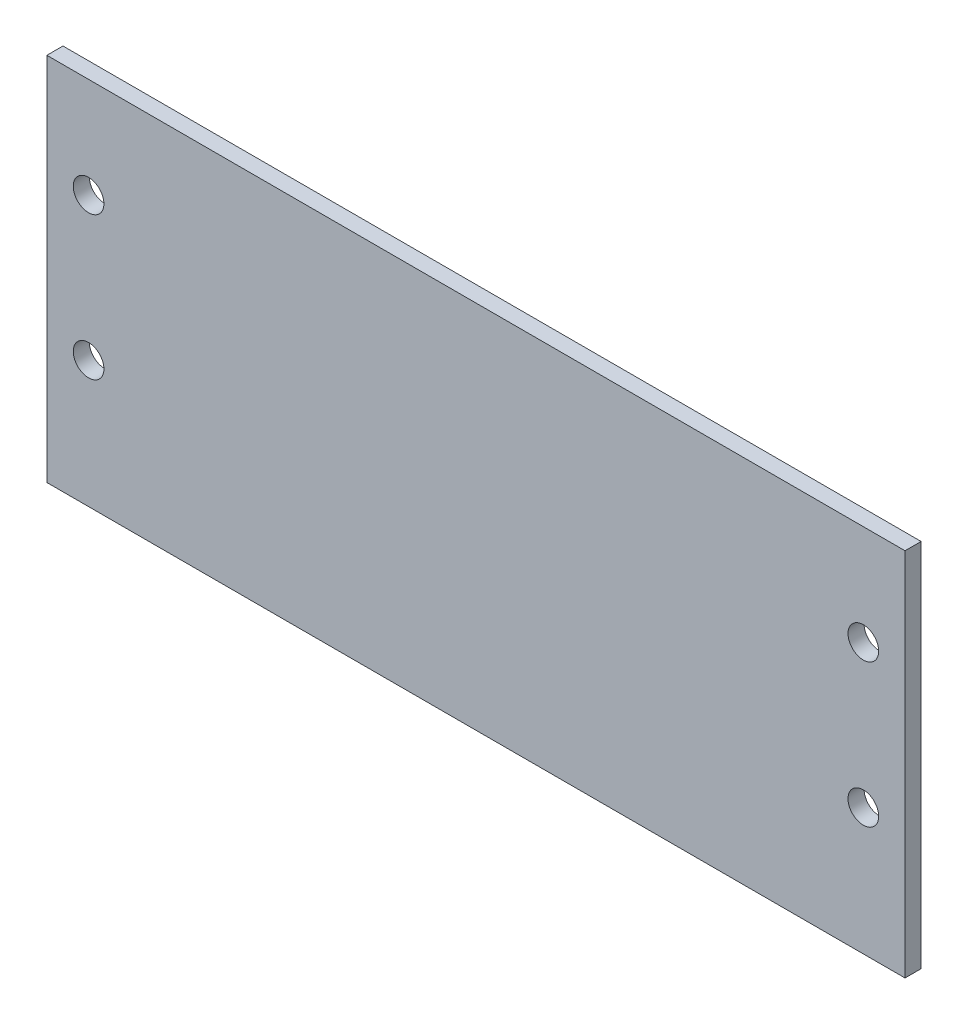
ISO-10303-21;
HEADER;
FILE_DESCRIPTION(('STEP AP214'),'2;1');
FILE_NAME('part.step','',(''),(''),'','','');
FILE_SCHEMA(('AUTOMOTIVE_DESIGN { 1 0 10303 214 1 1 1 1 }'));
ENDSEC;
DATA;
#1=APPLICATION_CONTEXT('core data for automotive mechanical design processes');
#2=APPLICATION_PROTOCOL_DEFINITION('international standard','automotive_design',2000,#1);
#3=PRODUCT_CONTEXT('',#1,'mechanical');
#4=PRODUCT('Part','Part','',(#3));
#5=PRODUCT_RELATED_PRODUCT_CATEGORY('part','',(#4));
#6=PRODUCT_DEFINITION_FORMATION('','',#4);
#7=PRODUCT_DEFINITION_CONTEXT('part definition',#1,'design');
#8=PRODUCT_DEFINITION('design','',#6,#7);
#9=PRODUCT_DEFINITION_SHAPE('','',#8);
#10=(LENGTH_UNIT() NAMED_UNIT(*) SI_UNIT(.MILLI.,.METRE.));
#11=(NAMED_UNIT(*) PLANE_ANGLE_UNIT() SI_UNIT($,.RADIAN.));
#12=(NAMED_UNIT(*) SI_UNIT($,.STERADIAN.) SOLID_ANGLE_UNIT());
#13=UNCERTAINTY_MEASURE_WITH_UNIT(LENGTH_MEASURE(1.E-05),#10,'distance_accuracy_value','');
#14=(GEOMETRIC_REPRESENTATION_CONTEXT(3) GLOBAL_UNCERTAINTY_ASSIGNED_CONTEXT((#13)) GLOBAL_UNIT_ASSIGNED_CONTEXT((#10,
#11,#12)) REPRESENTATION_CONTEXT('',''));
#15=CARTESIAN_POINT('',(0.,0.,0.));
#16=DIRECTION('',(0.,0.,1.));
#17=DIRECTION('',(1.,0.,0.));
#18=AXIS2_PLACEMENT_3D('',#15,#16,#17);
#19=CARTESIAN_POINT('',(-274.987878787879,130.65034965035,10.));
#20=DIRECTION('',(1.,0.,0.));
#21=DIRECTION('',(0.,0.,-1.));
#22=AXIS2_PLACEMENT_3D('',#19,#20,#21);
#23=PLANE('',#22);
#24=DIRECTION('',(0.,-1.,0.));
#25=VECTOR('',#24,1.);
#26=CARTESIAN_POINT('',(-274.987878787879,130.65034965035,0.));
#27=LINE('',#26,#25);
#28=CARTESIAN_POINT('',(-274.987878787879,130.65034965035,0.));
#29=VERTEX_POINT('',#28);
#30=CARTESIAN_POINT('',(-274.987878787879,-99.3496503496504,0.));
#31=VERTEX_POINT('',#30);
#32=EDGE_CURVE('E106',#29,#31,#27,.T.);
#33=ORIENTED_EDGE('',*,*,#32,.T.);
#34=DIRECTION('',(0.,0.,-1.));
#35=VECTOR('',#34,1.);
#36=CARTESIAN_POINT('',(-274.987878787879,-99.3496503496504,10.));
#37=LINE('',#36,#35);
#38=CARTESIAN_POINT('',(-274.987878787879,-99.3496503496504,10.));
#39=VERTEX_POINT('',#38);
#40=EDGE_CURVE('E11',#39,#31,#37,.T.);
#41=ORIENTED_EDGE('',*,*,#40,.F.);
#42=DIRECTION('',(0.,-1.,0.));
#43=VECTOR('',#42,1.);
#44=CARTESIAN_POINT('',(-274.987878787879,130.65034965035,10.));
#45=LINE('',#44,#43);
#46=CARTESIAN_POINT('',(-274.987878787879,130.65034965035,10.));
#47=VERTEX_POINT('',#46);
#48=EDGE_CURVE('E90',#47,#39,#45,.T.);
#49=ORIENTED_EDGE('',*,*,#48,.F.);
#50=DIRECTION('',(0.,0.,-1.));
#51=VECTOR('',#50,1.);
#52=CARTESIAN_POINT('',(-274.987878787879,130.65034965035,10.));
#53=LINE('',#52,#51);
#54=EDGE_CURVE('E102',#47,#29,#53,.T.);
#55=ORIENTED_EDGE('',*,*,#54,.T.);
#56=EDGE_LOOP('',(#33,#41,#49,#55));
#57=FACE_BOUND('',#56,.T.);
#58=ADVANCED_FACE('F38',(#57),#23,.F.);
#59=CARTESIAN_POINT('',(-274.987878787879,-99.3496503496504,10.));
#60=DIRECTION('',(0.,1.,0.));
#61=DIRECTION('',(0.,0.,1.));
#62=AXIS2_PLACEMENT_3D('',#59,#60,#61);
#63=PLANE('',#62);
#64=DIRECTION('',(1.,0.,0.));
#65=VECTOR('',#64,1.);
#66=CARTESIAN_POINT('',(-274.987878787879,-99.3496503496504,0.));
#67=LINE('',#66,#65);
#68=CARTESIAN_POINT('',(258.412121212121,-99.3496503496504,0.));
#69=VERTEX_POINT('',#68);
#70=EDGE_CURVE('E95',#31,#69,#67,.T.);
#71=ORIENTED_EDGE('',*,*,#70,.T.);
#72=DIRECTION('',(0.,0.,-1.));
#73=VECTOR('',#72,1.);
#74=CARTESIAN_POINT('',(258.412121212121,-99.3496503496504,10.));
#75=LINE('',#74,#73);
#76=CARTESIAN_POINT('',(258.412121212121,-99.3496503496504,10.));
#77=VERTEX_POINT('',#76);
#78=EDGE_CURVE('E47',#77,#69,#75,.T.);
#79=ORIENTED_EDGE('',*,*,#78,.F.);
#80=DIRECTION('',(1.,0.,0.));
#81=VECTOR('',#80,1.);
#82=CARTESIAN_POINT('',(-274.987878787879,-99.3496503496504,10.));
#83=LINE('',#82,#81);
#84=EDGE_CURVE('E85',#39,#77,#83,.T.);
#85=ORIENTED_EDGE('',*,*,#84,.F.);
#86=ORIENTED_EDGE('',*,*,#40,.T.);
#87=EDGE_LOOP('',(#71,#79,#85,#86));
#88=FACE_BOUND('',#87,.T.);
#89=ADVANCED_FACE('F94',(#88),#63,.F.);
#90=CARTESIAN_POINT('',(258.412121212121,130.65034965035,10.));
#91=DIRECTION('',(-1.,0.,0.));
#92=DIRECTION('',(0.,-1.,0.));
#93=AXIS2_PLACEMENT_3D('',#90,#91,#92);
#94=PLANE('',#93);
#95=DIRECTION('',(0.,1.,0.));
#96=VECTOR('',#95,1.);
#97=CARTESIAN_POINT('',(258.412121212121,130.65034965035,0.));
#98=LINE('',#97,#96);
#99=CARTESIAN_POINT('',(258.412121212121,130.65034965035,0.));
#100=VERTEX_POINT('',#99);
#101=EDGE_CURVE('E72',#69,#100,#98,.T.);
#102=ORIENTED_EDGE('',*,*,#101,.T.);
#103=DIRECTION('',(0.,0.,-1.));
#104=VECTOR('',#103,1.);
#105=CARTESIAN_POINT('',(258.412121212121,130.65034965035,10.));
#106=LINE('',#105,#104);
#107=CARTESIAN_POINT('',(258.412121212121,130.65034965035,10.));
#108=VERTEX_POINT('',#107);
#109=EDGE_CURVE('E97',#108,#100,#106,.T.);
#110=ORIENTED_EDGE('',*,*,#109,.F.);
#111=DIRECTION('',(0.,1.,0.));
#112=VECTOR('',#111,1.);
#113=CARTESIAN_POINT('',(258.412121212121,130.65034965035,10.));
#114=LINE('',#113,#112);
#115=EDGE_CURVE('E88',#77,#108,#114,.T.);
#116=ORIENTED_EDGE('',*,*,#115,.F.);
#117=ORIENTED_EDGE('',*,*,#78,.T.);
#118=EDGE_LOOP('',(#102,#110,#116,#117));
#119=FACE_BOUND('',#118,.T.);
#120=ADVANCED_FACE('F98',(#119),#94,.F.);
#121=CARTESIAN_POINT('',(-274.987878787879,130.65034965035,10.));
#122=DIRECTION('',(0.,-1.,0.));
#123=DIRECTION('',(0.,0.,-1.));
#124=AXIS2_PLACEMENT_3D('',#121,#122,#123);
#125=PLANE('',#124);
#126=DIRECTION('',(-1.,0.,0.));
#127=VECTOR('',#126,1.);
#128=CARTESIAN_POINT('',(-274.987878787879,130.65034965035,0.));
#129=LINE('',#128,#127);
#130=EDGE_CURVE('E78',#100,#29,#129,.T.);
#131=ORIENTED_EDGE('',*,*,#130,.T.);
#132=ORIENTED_EDGE('',*,*,#54,.F.);
#133=DIRECTION('',(-1.,0.,0.));
#134=VECTOR('',#133,1.);
#135=CARTESIAN_POINT('',(-274.987878787879,130.65034965035,10.));
#136=LINE('',#135,#134);
#137=EDGE_CURVE('E55',#108,#47,#136,.T.);
#138=ORIENTED_EDGE('',*,*,#137,.F.);
#139=ORIENTED_EDGE('',*,*,#109,.T.);
#140=EDGE_LOOP('',(#131,#132,#138,#139));
#141=FACE_BOUND('',#140,.T.);
#142=ADVANCED_FACE('F120',(#141),#125,.F.);
#143=CARTESIAN_POINT('',(0.,0.,10.));
#144=DIRECTION('',(0.,0.,1.));
#145=DIRECTION('',(1.,0.,0.));
#146=AXIS2_PLACEMENT_3D('',#143,#144,#145);
#147=PLANE('',#146);
#148=CARTESIAN_POINT('',(232.50412121212,-20.5276503496493,10.));
#149=DIRECTION('',(0.,0.,1.));
#150=DIRECTION('',(1.,0.,0.));
#151=AXIS2_PLACEMENT_3D('',#148,#149,#150);
#152=CIRCLE('',#151,9.52500000000002);
#153=CARTESIAN_POINT('',(242.02912121212,-20.5276503496493,10.));
#154=VERTEX_POINT('',#153);
#155=EDGE_CURVE('E144',#154,#154,#152,.T.);
#156=ORIENTED_EDGE('',*,*,#155,.F.);
#157=EDGE_LOOP('',(#156));
#158=FACE_BOUND('',#157,.T.);
#159=CARTESIAN_POINT('',(-249.07987878788,68.3723496503497,10.));
#160=DIRECTION('',(0.,0.,1.));
#161=DIRECTION('',(1.,0.,0.));
#162=AXIS2_PLACEMENT_3D('',#159,#160,#161);
#163=CIRCLE('',#162,9.52499999999991);
#164=CARTESIAN_POINT('',(-239.55487878788,68.3723496503497,10.));
#165=VERTEX_POINT('',#164);
#166=EDGE_CURVE('E135',#165,#165,#163,.T.);
#167=ORIENTED_EDGE('',*,*,#166,.F.);
#168=EDGE_LOOP('',(#167));
#169=FACE_BOUND('',#168,.T.);
#170=CARTESIAN_POINT('',(-249.07987878788,-20.5276503496492,10.));
#171=DIRECTION('',(0.,0.,1.));
#172=DIRECTION('',(1.,0.,0.));
#173=AXIS2_PLACEMENT_3D('',#170,#171,#172);
#174=CIRCLE('',#173,9.52499999999996);
#175=CARTESIAN_POINT('',(-239.55487878788,-20.5276503496492,10.));
#176=VERTEX_POINT('',#175);
#177=EDGE_CURVE('E151',#176,#176,#174,.T.);
#178=ORIENTED_EDGE('',*,*,#177,.F.);
#179=EDGE_LOOP('',(#178));
#180=FACE_BOUND('',#179,.T.);
#181=CARTESIAN_POINT('',(232.50412121212,68.3723496503496,10.));
#182=DIRECTION('',(0.,0.,1.));
#183=DIRECTION('',(1.,0.,0.));
#184=AXIS2_PLACEMENT_3D('',#181,#182,#183);
#185=CIRCLE('',#184,9.52499999999996);
#186=CARTESIAN_POINT('',(242.02912121212,68.3723496503496,10.));
#187=VERTEX_POINT('',#186);
#188=EDGE_CURVE('E127',#187,#187,#185,.T.);
#189=ORIENTED_EDGE('',*,*,#188,.F.);
#190=EDGE_LOOP('',(#189));
#191=FACE_BOUND('',#190,.T.);
#192=ORIENTED_EDGE('',*,*,#48,.T.);
#193=ORIENTED_EDGE('',*,*,#84,.T.);
#194=ORIENTED_EDGE('',*,*,#115,.T.);
#195=ORIENTED_EDGE('',*,*,#137,.T.);
#196=EDGE_LOOP('',(#192,#193,#194,#195));
#197=FACE_BOUND('',#196,.T.);
#198=ADVANCED_FACE('F86',(#158,#169,#180,#191,#197),#147,.T.);
#199=CARTESIAN_POINT('',(0.,0.,0.));
#200=DIRECTION('',(0.,0.,1.));
#201=DIRECTION('',(1.,0.,0.));
#202=AXIS2_PLACEMENT_3D('',#199,#200,#201);
#203=PLANE('',#202);
#204=CARTESIAN_POINT('',(232.50412121212,-20.5276503496493,0.));
#205=DIRECTION('',(0.,0.,1.));
#206=DIRECTION('',(1.,0.,0.));
#207=AXIS2_PLACEMENT_3D('',#204,#205,#206);
#208=CIRCLE('',#207,9.52500000000002);
#209=CARTESIAN_POINT('',(242.02912121212,-20.5276503496493,0.));
#210=VERTEX_POINT('',#209);
#211=EDGE_CURVE('E131',#210,#210,#208,.T.);
#212=ORIENTED_EDGE('',*,*,#211,.T.);
#213=EDGE_LOOP('',(#212));
#214=FACE_BOUND('',#213,.T.);
#215=CARTESIAN_POINT('',(-249.07987878788,68.3723496503497,0.));
#216=DIRECTION('',(0.,0.,1.));
#217=DIRECTION('',(1.,0.,0.));
#218=AXIS2_PLACEMENT_3D('',#215,#216,#217);
#219=CIRCLE('',#218,9.52499999999991);
#220=CARTESIAN_POINT('',(-239.55487878788,68.3723496503497,0.));
#221=VERTEX_POINT('',#220);
#222=EDGE_CURVE('E139',#221,#221,#219,.T.);
#223=ORIENTED_EDGE('',*,*,#222,.T.);
#224=EDGE_LOOP('',(#223));
#225=FACE_BOUND('',#224,.T.);
#226=CARTESIAN_POINT('',(-249.07987878788,-20.5276503496492,0.));
#227=DIRECTION('',(0.,0.,1.));
#228=DIRECTION('',(1.,0.,0.));
#229=AXIS2_PLACEMENT_3D('',#226,#227,#228);
#230=CIRCLE('',#229,9.52499999999996);
#231=CARTESIAN_POINT('',(-239.55487878788,-20.5276503496492,0.));
#232=VERTEX_POINT('',#231);
#233=EDGE_CURVE('E140',#232,#232,#230,.T.);
#234=ORIENTED_EDGE('',*,*,#233,.T.);
#235=EDGE_LOOP('',(#234));
#236=FACE_BOUND('',#235,.T.);
#237=CARTESIAN_POINT('',(232.50412121212,68.3723496503496,0.));
#238=DIRECTION('',(0.,0.,1.));
#239=DIRECTION('',(1.,0.,0.));
#240=AXIS2_PLACEMENT_3D('',#237,#238,#239);
#241=CIRCLE('',#240,9.52499999999996);
#242=CARTESIAN_POINT('',(242.02912121212,68.3723496503496,0.));
#243=VERTEX_POINT('',#242);
#244=EDGE_CURVE('E110',#243,#243,#241,.T.);
#245=ORIENTED_EDGE('',*,*,#244,.T.);
#246=EDGE_LOOP('',(#245));
#247=FACE_BOUND('',#246,.T.);
#248=ORIENTED_EDGE('',*,*,#32,.F.);
#249=ORIENTED_EDGE('',*,*,#130,.F.);
#250=ORIENTED_EDGE('',*,*,#101,.F.);
#251=ORIENTED_EDGE('',*,*,#70,.F.);
#252=EDGE_LOOP('',(#248,#249,#250,#251));
#253=FACE_BOUND('',#252,.T.);
#254=ADVANCED_FACE('F123',(#214,#225,#236,#247,#253),#203,.F.);
#255=CARTESIAN_POINT('',(232.50412121212,68.3723496503496,0.));
#256=DIRECTION('',(0.,0.,1.));
#257=DIRECTION('',(1.,0.,0.));
#258=AXIS2_PLACEMENT_3D('',#255,#256,#257);
#259=CYLINDRICAL_SURFACE('',#258,9.52499999999996);
#260=ORIENTED_EDGE('',*,*,#244,.F.);
#261=EDGE_LOOP('',(#260));
#262=FACE_BOUND('',#261,.T.);
#263=ORIENTED_EDGE('',*,*,#188,.T.);
#264=EDGE_LOOP('',(#263));
#265=FACE_BOUND('',#264,.T.);
#266=ADVANCED_FACE('F165',(#262,#265),#259,.F.);
#267=CARTESIAN_POINT('',(-249.07987878788,-20.5276503496492,0.));
#268=DIRECTION('',(0.,0.,1.));
#269=DIRECTION('',(1.,0.,0.));
#270=AXIS2_PLACEMENT_3D('',#267,#268,#269);
#271=CYLINDRICAL_SURFACE('',#270,9.52499999999996);
#272=ORIENTED_EDGE('',*,*,#233,.F.);
#273=EDGE_LOOP('',(#272));
#274=FACE_BOUND('',#273,.T.);
#275=ORIENTED_EDGE('',*,*,#177,.T.);
#276=EDGE_LOOP('',(#275));
#277=FACE_BOUND('',#276,.T.);
#278=ADVANCED_FACE('F161',(#274,#277),#271,.F.);
#279=CARTESIAN_POINT('',(-249.07987878788,68.3723496503497,0.));
#280=DIRECTION('',(0.,0.,1.));
#281=DIRECTION('',(1.,0.,0.));
#282=AXIS2_PLACEMENT_3D('',#279,#280,#281);
#283=CYLINDRICAL_SURFACE('',#282,9.52499999999991);
#284=ORIENTED_EDGE('',*,*,#222,.F.);
#285=EDGE_LOOP('',(#284));
#286=FACE_BOUND('',#285,.T.);
#287=ORIENTED_EDGE('',*,*,#166,.T.);
#288=EDGE_LOOP('',(#287));
#289=FACE_BOUND('',#288,.T.);
#290=ADVANCED_FACE('F164',(#286,#289),#283,.F.);
#291=CARTESIAN_POINT('',(232.50412121212,-20.5276503496493,0.));
#292=DIRECTION('',(0.,0.,1.));
#293=DIRECTION('',(1.,0.,0.));
#294=AXIS2_PLACEMENT_3D('',#291,#292,#293);
#295=CYLINDRICAL_SURFACE('',#294,9.52500000000002);
#296=ORIENTED_EDGE('',*,*,#211,.F.);
#297=EDGE_LOOP('',(#296));
#298=FACE_BOUND('',#297,.T.);
#299=ORIENTED_EDGE('',*,*,#155,.T.);
#300=EDGE_LOOP('',(#299));
#301=FACE_BOUND('',#300,.T.);
#302=ADVANCED_FACE('F228',(#298,#301),#295,.F.);
#303=CLOSED_SHELL('',(#58,#89,#120,#142,#198,#254,#266,#278,#290,#302));
#304=MANIFOLD_SOLID_BREP('B2',#303);
#305=ADVANCED_BREP_SHAPE_REPRESENTATION('',(#18,#304),#14);
#306=SHAPE_DEFINITION_REPRESENTATION(#9,#305);
ENDSEC;
END-ISO-10303-21;
